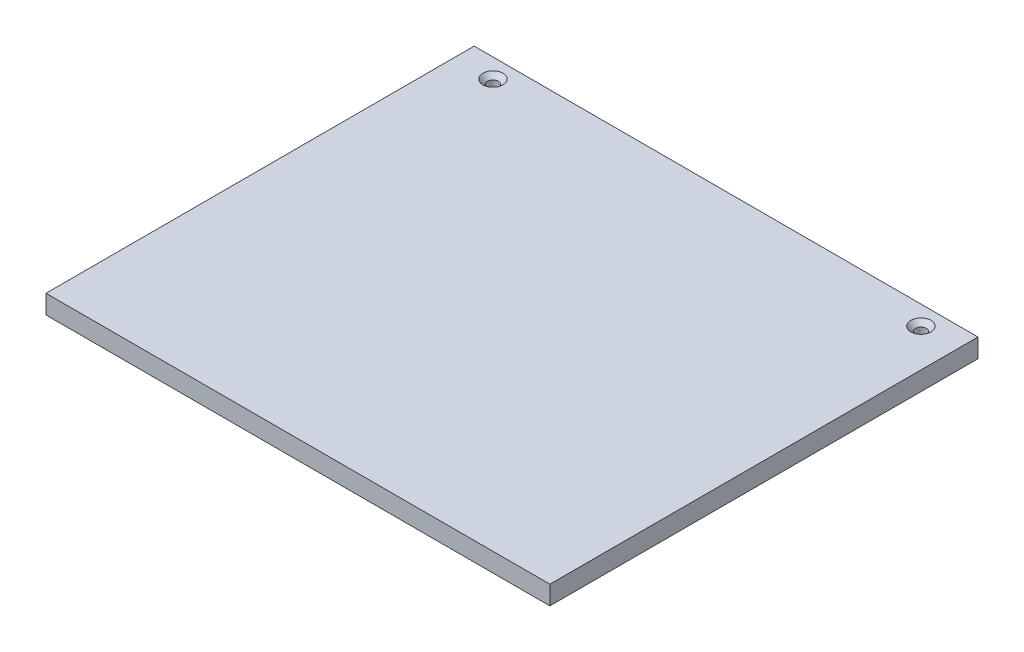
ISO-10303-21;
HEADER;
FILE_DESCRIPTION(('STEP AP214'),'2;1');
FILE_NAME('part.step','',(''),(''),'','','');
FILE_SCHEMA(('AUTOMOTIVE_DESIGN { 1 0 10303 214 1 1 1 1 }'));
ENDSEC;
DATA;
#1=APPLICATION_CONTEXT('core data for automotive mechanical design processes');
#2=APPLICATION_PROTOCOL_DEFINITION('international standard','automotive_design',2000,#1);
#3=PRODUCT_CONTEXT('',#1,'mechanical');
#4=PRODUCT('Part','Part','',(#3));
#5=PRODUCT_RELATED_PRODUCT_CATEGORY('part','',(#4));
#6=PRODUCT_DEFINITION_FORMATION('','',#4);
#7=PRODUCT_DEFINITION_CONTEXT('part definition',#1,'design');
#8=PRODUCT_DEFINITION('design','',#6,#7);
#9=PRODUCT_DEFINITION_SHAPE('','',#8);
#10=(LENGTH_UNIT() NAMED_UNIT(*) SI_UNIT(.MILLI.,.METRE.));
#11=(NAMED_UNIT(*) PLANE_ANGLE_UNIT() SI_UNIT($,.RADIAN.));
#12=(NAMED_UNIT(*) SI_UNIT($,.STERADIAN.) SOLID_ANGLE_UNIT());
#13=UNCERTAINTY_MEASURE_WITH_UNIT(LENGTH_MEASURE(1.E-05),#10,'distance_accuracy_value','');
#14=(GEOMETRIC_REPRESENTATION_CONTEXT(3) GLOBAL_UNCERTAINTY_ASSIGNED_CONTEXT((#13)) GLOBAL_UNIT_ASSIGNED_CONTEXT((#10,
#11,#12)) REPRESENTATION_CONTEXT('',''));
#15=CARTESIAN_POINT('',(0.,0.,0.));
#16=DIRECTION('',(0.,0.,1.));
#17=DIRECTION('',(1.,0.,0.));
#18=AXIS2_PLACEMENT_3D('',#15,#16,#17);
#19=CARTESIAN_POINT('',(79.,5.9,-67.125));
#20=DIRECTION('',(-1.,0.,0.));
#21=DIRECTION('',(0.,0.,1.));
#22=AXIS2_PLACEMENT_3D('',#19,#20,#21);
#23=PLANE('',#22);
#24=DIRECTION('',(0.,0.,-1.));
#25=VECTOR('',#24,1.);
#26=CARTESIAN_POINT('',(79.,0.,-67.125));
#27=LINE('',#26,#25);
#28=CARTESIAN_POINT('',(79.,0.,67.125));
#29=VERTEX_POINT('',#28);
#30=CARTESIAN_POINT('',(79.,0.,-67.125));
#31=VERTEX_POINT('',#30);
#32=EDGE_CURVE('E99',#29,#31,#27,.T.);
#33=ORIENTED_EDGE('',*,*,#32,.T.);
#34=DIRECTION('',(0.,-1.,0.));
#35=VECTOR('',#34,1.);
#36=CARTESIAN_POINT('',(79.,5.9,-67.125));
#37=LINE('',#36,#35);
#38=CARTESIAN_POINT('',(79.,5.9,-67.125));
#39=VERTEX_POINT('',#38);
#40=EDGE_CURVE('E11',#39,#31,#37,.T.);
#41=ORIENTED_EDGE('',*,*,#40,.F.);
#42=DIRECTION('',(0.,0.,-1.));
#43=VECTOR('',#42,1.);
#44=CARTESIAN_POINT('',(79.,5.9,-67.125));
#45=LINE('',#44,#43);
#46=CARTESIAN_POINT('',(79.,5.9,67.125));
#47=VERTEX_POINT('',#46);
#48=EDGE_CURVE('E86',#47,#39,#45,.T.);
#49=ORIENTED_EDGE('',*,*,#48,.F.);
#50=DIRECTION('',(0.,-1.,0.));
#51=VECTOR('',#50,1.);
#52=CARTESIAN_POINT('',(79.,5.9,67.125));
#53=LINE('',#52,#51);
#54=EDGE_CURVE('E95',#47,#29,#53,.T.);
#55=ORIENTED_EDGE('',*,*,#54,.T.);
#56=EDGE_LOOP('',(#33,#41,#49,#55));
#57=FACE_BOUND('',#56,.T.);
#58=ADVANCED_FACE('F33',(#57),#23,.F.);
#59=CARTESIAN_POINT('',(-79.,5.9,-67.125));
#60=DIRECTION('',(0.,0.,1.));
#61=DIRECTION('',(1.,0.,0.));
#62=AXIS2_PLACEMENT_3D('',#59,#60,#61);
#63=PLANE('',#62);
#64=DIRECTION('',(-1.,0.,0.));
#65=VECTOR('',#64,1.);
#66=CARTESIAN_POINT('',(-79.,0.,-67.125));
#67=LINE('',#66,#65);
#68=CARTESIAN_POINT('',(-79.,0.,-67.125));
#69=VERTEX_POINT('',#68);
#70=EDGE_CURVE('E90',#31,#69,#67,.T.);
#71=ORIENTED_EDGE('',*,*,#70,.T.);
#72=DIRECTION('',(0.,-1.,0.));
#73=VECTOR('',#72,1.);
#74=CARTESIAN_POINT('',(-79.,5.9,-67.125));
#75=LINE('',#74,#73);
#76=CARTESIAN_POINT('',(-79.,5.9,-67.125));
#77=VERTEX_POINT('',#76);
#78=EDGE_CURVE('E42',#77,#69,#75,.T.);
#79=ORIENTED_EDGE('',*,*,#78,.F.);
#80=DIRECTION('',(-1.,0.,0.));
#81=VECTOR('',#80,1.);
#82=CARTESIAN_POINT('',(-79.,5.9,-67.125));
#83=LINE('',#82,#81);
#84=EDGE_CURVE('E81',#39,#77,#83,.T.);
#85=ORIENTED_EDGE('',*,*,#84,.F.);
#86=ORIENTED_EDGE('',*,*,#40,.T.);
#87=EDGE_LOOP('',(#71,#79,#85,#86));
#88=FACE_BOUND('',#87,.T.);
#89=ADVANCED_FACE('F89',(#88),#63,.F.);
#90=CARTESIAN_POINT('',(-79.,5.9,-67.125));
#91=DIRECTION('',(1.,0.,0.));
#92=DIRECTION('',(0.,0.,-1.));
#93=AXIS2_PLACEMENT_3D('',#90,#91,#92);
#94=PLANE('',#93);
#95=DIRECTION('',(0.,0.,1.));
#96=VECTOR('',#95,1.);
#97=CARTESIAN_POINT('',(-79.,0.,-67.125));
#98=LINE('',#97,#96);
#99=CARTESIAN_POINT('',(-79.,0.,67.125));
#100=VERTEX_POINT('',#99);
#101=EDGE_CURVE('E68',#69,#100,#98,.T.);
#102=ORIENTED_EDGE('',*,*,#101,.T.);
#103=DIRECTION('',(0.,-1.,0.));
#104=VECTOR('',#103,1.);
#105=CARTESIAN_POINT('',(-79.,5.9,67.125));
#106=LINE('',#105,#104);
#107=CARTESIAN_POINT('',(-79.,5.9,67.125));
#108=VERTEX_POINT('',#107);
#109=EDGE_CURVE('E91',#108,#100,#106,.T.);
#110=ORIENTED_EDGE('',*,*,#109,.F.);
#111=DIRECTION('',(0.,0.,1.));
#112=VECTOR('',#111,1.);
#113=CARTESIAN_POINT('',(-79.,5.9,-67.125));
#114=LINE('',#113,#112);
#115=EDGE_CURVE('E84',#77,#108,#114,.T.);
#116=ORIENTED_EDGE('',*,*,#115,.F.);
#117=ORIENTED_EDGE('',*,*,#78,.T.);
#118=EDGE_LOOP('',(#102,#110,#116,#117));
#119=FACE_BOUND('',#118,.T.);
#120=ADVANCED_FACE('F93',(#119),#94,.F.);
#121=CARTESIAN_POINT('',(-79.,5.9,67.125));
#122=DIRECTION('',(0.,0.,-1.));
#123=DIRECTION('',(-1.,0.,0.));
#124=AXIS2_PLACEMENT_3D('',#121,#122,#123);
#125=PLANE('',#124);
#126=DIRECTION('',(1.,0.,0.));
#127=VECTOR('',#126,1.);
#128=CARTESIAN_POINT('',(-79.,0.,67.125));
#129=LINE('',#128,#127);
#130=EDGE_CURVE('E74',#100,#29,#129,.T.);
#131=ORIENTED_EDGE('',*,*,#130,.T.);
#132=ORIENTED_EDGE('',*,*,#54,.F.);
#133=DIRECTION('',(1.,0.,0.));
#134=VECTOR('',#133,1.);
#135=CARTESIAN_POINT('',(-79.,5.9,67.125));
#136=LINE('',#135,#134);
#137=EDGE_CURVE('E51',#108,#47,#136,.T.);
#138=ORIENTED_EDGE('',*,*,#137,.F.);
#139=ORIENTED_EDGE('',*,*,#109,.T.);
#140=EDGE_LOOP('',(#131,#132,#138,#139));
#141=FACE_BOUND('',#140,.T.);
#142=ADVANCED_FACE('F131',(#141),#125,.F.);
#143=CARTESIAN_POINT('',(0.,5.9,0.));
#144=DIRECTION('',(0.,1.,0.));
#145=DIRECTION('',(0.,0.,1.));
#146=AXIS2_PLACEMENT_3D('',#143,#144,#145);
#147=PLANE('',#146);
#148=CARTESIAN_POINT('',(-67.0999999999999,5.9,-61.125));
#149=DIRECTION('',(0.,1.,0.));
#150=DIRECTION('',(0.,0.,1.));
#151=AXIS2_PLACEMENT_3D('',#148,#149,#150);
#152=CIRCLE('',#151,3.15);
#153=CARTESIAN_POINT('',(-67.0999999999999,5.9,-57.975));
#154=VERTEX_POINT('',#153);
#155=EDGE_CURVE('E122',#154,#154,#152,.T.);
#156=ORIENTED_EDGE('',*,*,#155,.F.);
#157=EDGE_LOOP('',(#156));
#158=FACE_BOUND('',#157,.T.);
#159=CARTESIAN_POINT('',(67.1,5.9,-61.125));
#160=DIRECTION('',(0.,1.,0.));
#161=DIRECTION('',(0.,0.,1.));
#162=AXIS2_PLACEMENT_3D('',#159,#160,#161);
#163=CIRCLE('',#162,3.15);
#164=CARTESIAN_POINT('',(67.1,5.9,-57.975));
#165=VERTEX_POINT('',#164);
#166=EDGE_CURVE('E112',#165,#165,#163,.T.);
#167=ORIENTED_EDGE('',*,*,#166,.F.);
#168=EDGE_LOOP('',(#167));
#169=FACE_BOUND('',#168,.T.);
#170=ORIENTED_EDGE('',*,*,#48,.T.);
#171=ORIENTED_EDGE('',*,*,#84,.T.);
#172=ORIENTED_EDGE('',*,*,#115,.T.);
#173=ORIENTED_EDGE('',*,*,#137,.T.);
#174=EDGE_LOOP('',(#170,#171,#172,#173));
#175=FACE_BOUND('',#174,.T.);
#176=ADVANCED_FACE('F82',(#158,#169,#175),#147,.T.);
#177=CARTESIAN_POINT('',(0.,0.,0.));
#178=DIRECTION('',(0.,1.,0.));
#179=DIRECTION('',(0.,0.,1.));
#180=AXIS2_PLACEMENT_3D('',#177,#178,#179);
#181=PLANE('',#180);
#182=CARTESIAN_POINT('',(-67.0999999999999,0.,-61.125));
#183=DIRECTION('',(0.,1.,0.));
#184=DIRECTION('',(0.,0.,1.));
#185=AXIS2_PLACEMENT_3D('',#182,#183,#184);
#186=CIRCLE('',#185,1.69999999999999);
#187=CARTESIAN_POINT('',(-67.0999999999999,0.,-59.425));
#188=VERTEX_POINT('',#187);
#189=EDGE_CURVE('E36',#188,#188,#186,.T.);
#190=ORIENTED_EDGE('',*,*,#189,.T.);
#191=EDGE_LOOP('',(#190));
#192=FACE_BOUND('',#191,.T.);
#193=CARTESIAN_POINT('',(67.1,0.,-61.125));
#194=DIRECTION('',(0.,1.,0.));
#195=DIRECTION('',(0.,0.,1.));
#196=AXIS2_PLACEMENT_3D('',#193,#194,#195);
#197=CIRCLE('',#196,1.69999999999999);
#198=CARTESIAN_POINT('',(67.1,0.,-59.425));
#199=VERTEX_POINT('',#198);
#200=EDGE_CURVE('E102',#199,#199,#197,.T.);
#201=ORIENTED_EDGE('',*,*,#200,.T.);
#202=EDGE_LOOP('',(#201));
#203=FACE_BOUND('',#202,.T.);
#204=ORIENTED_EDGE('',*,*,#32,.F.);
#205=ORIENTED_EDGE('',*,*,#130,.F.);
#206=ORIENTED_EDGE('',*,*,#101,.F.);
#207=ORIENTED_EDGE('',*,*,#70,.F.);
#208=EDGE_LOOP('',(#204,#205,#206,#207));
#209=FACE_BOUND('',#208,.T.);
#210=ADVANCED_FACE('F130',(#192,#203,#209),#181,.F.);
#211=CARTESIAN_POINT('',(67.1,5.9,-61.125));
#212=DIRECTION('',(0.,1.,0.));
#213=DIRECTION('',(0.,0.,1.));
#214=AXIS2_PLACEMENT_3D('',#211,#212,#213);
#215=CYLINDRICAL_SURFACE('',#214,1.69999999999999);
#216=CARTESIAN_POINT('',(67.1,4.45,-61.125));
#217=DIRECTION('',(0.,1.,0.));
#218=DIRECTION('',(0.,0.,1.));
#219=AXIS2_PLACEMENT_3D('',#216,#217,#218);
#220=CIRCLE('',#219,1.69999999999999);
#221=CARTESIAN_POINT('',(67.1,4.45,-59.425));
#222=VERTEX_POINT('',#221);
#223=EDGE_CURVE('E108',#222,#222,#220,.T.);
#224=ORIENTED_EDGE('',*,*,#223,.T.);
#225=EDGE_LOOP('',(#224));
#226=FACE_BOUND('',#225,.T.);
#227=ORIENTED_EDGE('',*,*,#200,.F.);
#228=EDGE_LOOP('',(#227));
#229=FACE_BOUND('',#228,.T.);
#230=ADVANCED_FACE('F138',(#226,#229),#215,.F.);
#231=CARTESIAN_POINT('',(67.1,5.9,-61.125));
#232=DIRECTION('',(0.,1.,0.));
#233=DIRECTION('',(0.,0.,1.));
#234=AXIS2_PLACEMENT_3D('',#231,#232,#233);
#235=CONICAL_SURFACE('',#234,3.15,0.78539816339745);
#236=ORIENTED_EDGE('',*,*,#223,.F.);
#237=EDGE_LOOP('',(#236));
#238=FACE_BOUND('',#237,.T.);
#239=ORIENTED_EDGE('',*,*,#166,.T.);
#240=EDGE_LOOP('',(#239));
#241=FACE_BOUND('',#240,.T.);
#242=ADVANCED_FACE('F135',(#238,#241),#235,.F.);
#243=CARTESIAN_POINT('',(-67.0999999999999,5.9,-61.125));
#244=DIRECTION('',(0.,1.,0.));
#245=DIRECTION('',(0.,0.,1.));
#246=AXIS2_PLACEMENT_3D('',#243,#244,#245);
#247=CYLINDRICAL_SURFACE('',#246,1.69999999999999);
#248=CARTESIAN_POINT('',(-67.0999999999999,4.45,-61.125));
#249=DIRECTION('',(0.,1.,0.));
#250=DIRECTION('',(0.,0.,1.));
#251=AXIS2_PLACEMENT_3D('',#248,#249,#250);
#252=CIRCLE('',#251,1.69999999999999);
#253=CARTESIAN_POINT('',(-67.0999999999999,4.45,-59.425));
#254=VERTEX_POINT('',#253);
#255=EDGE_CURVE('E119',#254,#254,#252,.T.);
#256=ORIENTED_EDGE('',*,*,#255,.T.);
#257=EDGE_LOOP('',(#256));
#258=FACE_BOUND('',#257,.T.);
#259=ORIENTED_EDGE('',*,*,#189,.F.);
#260=EDGE_LOOP('',(#259));
#261=FACE_BOUND('',#260,.T.);
#262=ADVANCED_FACE('F137',(#258,#261),#247,.F.);
#263=CARTESIAN_POINT('',(-67.0999999999999,5.9,-61.125));
#264=DIRECTION('',(0.,1.,0.));
#265=DIRECTION('',(0.,0.,1.));
#266=AXIS2_PLACEMENT_3D('',#263,#264,#265);
#267=CONICAL_SURFACE('',#266,3.15,0.78539816339745);
#268=ORIENTED_EDGE('',*,*,#255,.F.);
#269=EDGE_LOOP('',(#268));
#270=FACE_BOUND('',#269,.T.);
#271=ORIENTED_EDGE('',*,*,#155,.T.);
#272=EDGE_LOOP('',(#271));
#273=FACE_BOUND('',#272,.T.);
#274=ADVANCED_FACE('F126',(#270,#273),#267,.F.);
#275=CLOSED_SHELL('',(#58,#89,#120,#142,#176,#210,#230,#242,#262,#274));
#276=MANIFOLD_SOLID_BREP('B2',#275);
#277=ADVANCED_BREP_SHAPE_REPRESENTATION('',(#18,#276),#14);
#278=SHAPE_DEFINITION_REPRESENTATION(#9,#277);
ENDSEC;
END-ISO-10303-21;
